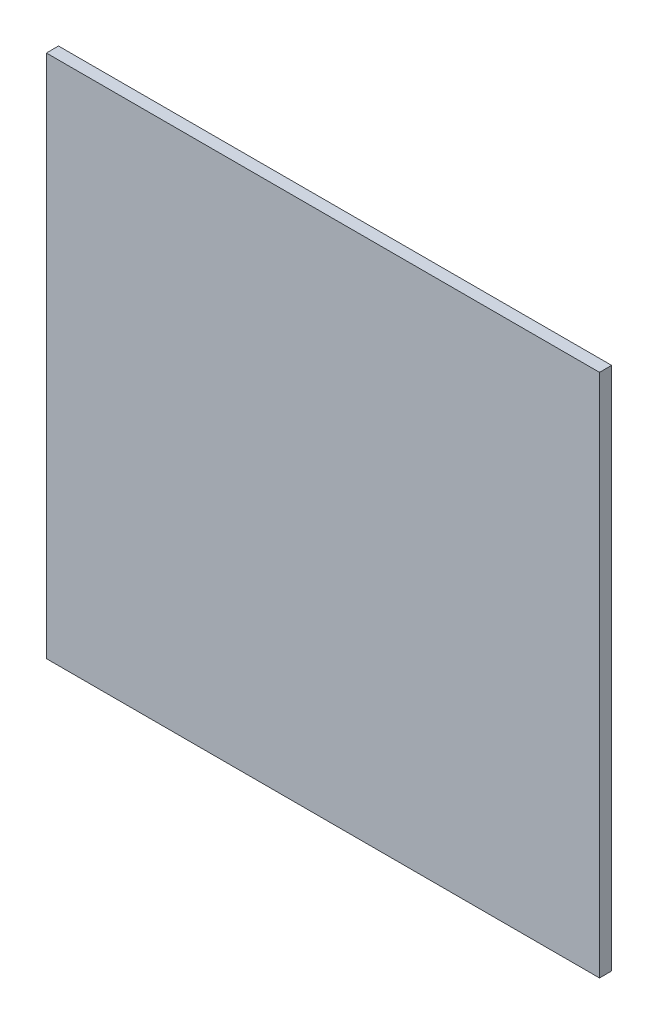
ISO-10303-21;
HEADER;
FILE_DESCRIPTION(('STEP AP214'),'2;1');
FILE_NAME('part.step','',(''),(''),'','','');
FILE_SCHEMA(('AUTOMOTIVE_DESIGN { 1 0 10303 214 1 1 1 1 }'));
ENDSEC;
DATA;
#1=APPLICATION_CONTEXT('core data for automotive mechanical design processes');
#2=APPLICATION_PROTOCOL_DEFINITION('international standard','automotive_design',2000,#1);
#3=PRODUCT_CONTEXT('',#1,'mechanical');
#4=PRODUCT('Part','Part','',(#3));
#5=PRODUCT_RELATED_PRODUCT_CATEGORY('part','',(#4));
#6=PRODUCT_DEFINITION_FORMATION('','',#4);
#7=PRODUCT_DEFINITION_CONTEXT('part definition',#1,'design');
#8=PRODUCT_DEFINITION('design','',#6,#7);
#9=PRODUCT_DEFINITION_SHAPE('','',#8);
#10=(LENGTH_UNIT() NAMED_UNIT(*) SI_UNIT(.MILLI.,.METRE.));
#11=(NAMED_UNIT(*) PLANE_ANGLE_UNIT() SI_UNIT($,.RADIAN.));
#12=(NAMED_UNIT(*) SI_UNIT($,.STERADIAN.) SOLID_ANGLE_UNIT());
#13=UNCERTAINTY_MEASURE_WITH_UNIT(LENGTH_MEASURE(1.E-05),#10,'distance_accuracy_value','');
#14=(GEOMETRIC_REPRESENTATION_CONTEXT(3) GLOBAL_UNCERTAINTY_ASSIGNED_CONTEXT((#13)) GLOBAL_UNIT_ASSIGNED_CONTEXT((#10,
#11,#12)) REPRESENTATION_CONTEXT('',''));
#15=CARTESIAN_POINT('',(0.,0.,0.));
#16=DIRECTION('',(0.,0.,1.));
#17=DIRECTION('',(1.,0.,0.));
#18=AXIS2_PLACEMENT_3D('',#15,#16,#17);
#19=CARTESIAN_POINT('',(145.,137.5,6.35));
#20=DIRECTION('',(-1.,0.,0.));
#21=DIRECTION('',(0.,-1.,0.));
#22=AXIS2_PLACEMENT_3D('',#19,#20,#21);
#23=PLANE('',#22);
#24=DIRECTION('',(0.,1.,0.));
#25=VECTOR('',#24,1.);
#26=CARTESIAN_POINT('',(145.,137.5,0.));
#27=LINE('',#26,#25);
#28=CARTESIAN_POINT('',(145.,-137.5,0.));
#29=VERTEX_POINT('',#28);
#30=CARTESIAN_POINT('',(145.,137.5,0.));
#31=VERTEX_POINT('',#30);
#32=EDGE_CURVE('E111',#29,#31,#27,.T.);
#33=ORIENTED_EDGE('',*,*,#32,.T.);
#34=DIRECTION('',(0.,0.,-1.));
#35=VECTOR('',#34,1.);
#36=CARTESIAN_POINT('',(145.,137.5,6.35));
#37=LINE('',#36,#35);
#38=CARTESIAN_POINT('',(145.,137.5,6.35));
#39=VERTEX_POINT('',#38);
#40=EDGE_CURVE('E11',#39,#31,#37,.T.);
#41=ORIENTED_EDGE('',*,*,#40,.F.);
#42=DIRECTION('',(0.,1.,0.));
#43=VECTOR('',#42,1.);
#44=CARTESIAN_POINT('',(145.,137.5,6.35));
#45=LINE('',#44,#43);
#46=CARTESIAN_POINT('',(145.,-137.5,6.35));
#47=VERTEX_POINT('',#46);
#48=EDGE_CURVE('E95',#47,#39,#45,.T.);
#49=ORIENTED_EDGE('',*,*,#48,.F.);
#50=DIRECTION('',(0.,0.,-1.));
#51=VECTOR('',#50,1.);
#52=CARTESIAN_POINT('',(145.,-137.5,6.35));
#53=LINE('',#52,#51);
#54=EDGE_CURVE('E107',#47,#29,#53,.T.);
#55=ORIENTED_EDGE('',*,*,#54,.T.);
#56=EDGE_LOOP('',(#33,#41,#49,#55));
#57=FACE_BOUND('',#56,.T.);
#58=ADVANCED_FACE('F43',(#57),#23,.F.);
#59=CARTESIAN_POINT('',(-145.,137.5,6.35));
#60=DIRECTION('',(0.,-1.,0.));
#61=DIRECTION('',(0.,0.,-1.));
#62=AXIS2_PLACEMENT_3D('',#59,#60,#61);
#63=PLANE('',#62);
#64=DIRECTION('',(-1.,0.,0.));
#65=VECTOR('',#64,1.);
#66=CARTESIAN_POINT('',(-145.,137.5,0.));
#67=LINE('',#66,#65);
#68=CARTESIAN_POINT('',(-145.,137.5,0.));
#69=VERTEX_POINT('',#68);
#70=EDGE_CURVE('E100',#31,#69,#67,.T.);
#71=ORIENTED_EDGE('',*,*,#70,.T.);
#72=DIRECTION('',(0.,0.,-1.));
#73=VECTOR('',#72,1.);
#74=CARTESIAN_POINT('',(-145.,137.5,6.35));
#75=LINE('',#74,#73);
#76=CARTESIAN_POINT('',(-145.,137.5,6.35));
#77=VERTEX_POINT('',#76);
#78=EDGE_CURVE('E52',#77,#69,#75,.T.);
#79=ORIENTED_EDGE('',*,*,#78,.F.);
#80=DIRECTION('',(-1.,0.,0.));
#81=VECTOR('',#80,1.);
#82=CARTESIAN_POINT('',(-145.,137.5,6.35));
#83=LINE('',#82,#81);
#84=EDGE_CURVE('E90',#39,#77,#83,.T.);
#85=ORIENTED_EDGE('',*,*,#84,.F.);
#86=ORIENTED_EDGE('',*,*,#40,.T.);
#87=EDGE_LOOP('',(#71,#79,#85,#86));
#88=FACE_BOUND('',#87,.T.);
#89=ADVANCED_FACE('F99',(#88),#63,.F.);
#90=CARTESIAN_POINT('',(-145.,137.5,6.35));
#91=DIRECTION('',(1.,0.,0.));
#92=DIRECTION('',(0.,1.,0.));
#93=AXIS2_PLACEMENT_3D('',#90,#91,#92);
#94=PLANE('',#93);
#95=DIRECTION('',(0.,-1.,0.));
#96=VECTOR('',#95,1.);
#97=CARTESIAN_POINT('',(-145.,137.5,0.));
#98=LINE('',#97,#96);
#99=CARTESIAN_POINT('',(-145.,-137.5,0.));
#100=VERTEX_POINT('',#99);
#101=EDGE_CURVE('E77',#69,#100,#98,.T.);
#102=ORIENTED_EDGE('',*,*,#101,.T.);
#103=DIRECTION('',(0.,0.,-1.));
#104=VECTOR('',#103,1.);
#105=CARTESIAN_POINT('',(-145.,-137.5,6.35));
#106=LINE('',#105,#104);
#107=CARTESIAN_POINT('',(-145.,-137.5,6.35));
#108=VERTEX_POINT('',#107);
#109=EDGE_CURVE('E102',#108,#100,#106,.T.);
#110=ORIENTED_EDGE('',*,*,#109,.F.);
#111=DIRECTION('',(0.,-1.,0.));
#112=VECTOR('',#111,1.);
#113=CARTESIAN_POINT('',(-145.,137.5,6.35));
#114=LINE('',#113,#112);
#115=EDGE_CURVE('E93',#77,#108,#114,.T.);
#116=ORIENTED_EDGE('',*,*,#115,.F.);
#117=ORIENTED_EDGE('',*,*,#78,.T.);
#118=EDGE_LOOP('',(#102,#110,#116,#117));
#119=FACE_BOUND('',#118,.T.);
#120=ADVANCED_FACE('F103',(#119),#94,.F.);
#121=CARTESIAN_POINT('',(-145.,-137.5,6.35));
#122=DIRECTION('',(0.,1.,0.));
#123=DIRECTION('',(0.,0.,1.));
#124=AXIS2_PLACEMENT_3D('',#121,#122,#123);
#125=PLANE('',#124);
#126=DIRECTION('',(1.,0.,0.));
#127=VECTOR('',#126,1.);
#128=CARTESIAN_POINT('',(-145.,-137.5,0.));
#129=LINE('',#128,#127);
#130=EDGE_CURVE('E83',#100,#29,#129,.T.);
#131=ORIENTED_EDGE('',*,*,#130,.T.);
#132=ORIENTED_EDGE('',*,*,#54,.F.);
#133=DIRECTION('',(1.,0.,0.));
#134=VECTOR('',#133,1.);
#135=CARTESIAN_POINT('',(-145.,-137.5,6.35));
#136=LINE('',#135,#134);
#137=EDGE_CURVE('E60',#108,#47,#136,.T.);
#138=ORIENTED_EDGE('',*,*,#137,.F.);
#139=ORIENTED_EDGE('',*,*,#109,.T.);
#140=EDGE_LOOP('',(#131,#132,#138,#139));
#141=FACE_BOUND('',#140,.T.);
#142=ADVANCED_FACE('F124',(#141),#125,.F.);
#143=CARTESIAN_POINT('',(0.,0.,6.35));
#144=DIRECTION('',(0.,0.,1.));
#145=DIRECTION('',(1.,0.,0.));
#146=AXIS2_PLACEMENT_3D('',#143,#144,#145);
#147=PLANE('',#146);
#148=ORIENTED_EDGE('',*,*,#48,.T.);
#149=ORIENTED_EDGE('',*,*,#84,.T.);
#150=ORIENTED_EDGE('',*,*,#115,.T.);
#151=ORIENTED_EDGE('',*,*,#137,.T.);
#152=EDGE_LOOP('',(#148,#149,#150,#151));
#153=FACE_BOUND('',#152,.T.);
#154=ADVANCED_FACE('F91',(#153),#147,.T.);
#155=CARTESIAN_POINT('',(0.,0.,0.));
#156=DIRECTION('',(0.,0.,1.));
#157=DIRECTION('',(1.,0.,0.));
#158=AXIS2_PLACEMENT_3D('',#155,#156,#157);
#159=PLANE('',#158);
#160=ORIENTED_EDGE('',*,*,#32,.F.);
#161=ORIENTED_EDGE('',*,*,#130,.F.);
#162=ORIENTED_EDGE('',*,*,#101,.F.);
#163=ORIENTED_EDGE('',*,*,#70,.F.);
#164=EDGE_LOOP('',(#160,#161,#162,#163));
#165=FACE_BOUND('',#164,.T.);
#166=ADVANCED_FACE('F127',(#165),#159,.F.);
#167=CLOSED_SHELL('',(#58,#89,#120,#142,#154,#166));
#168=MANIFOLD_SOLID_BREP('B2',#167);
#169=ADVANCED_BREP_SHAPE_REPRESENTATION('',(#18,#168),#14);
#170=SHAPE_DEFINITION_REPRESENTATION(#9,#169);
ENDSEC;
END-ISO-10303-21;
